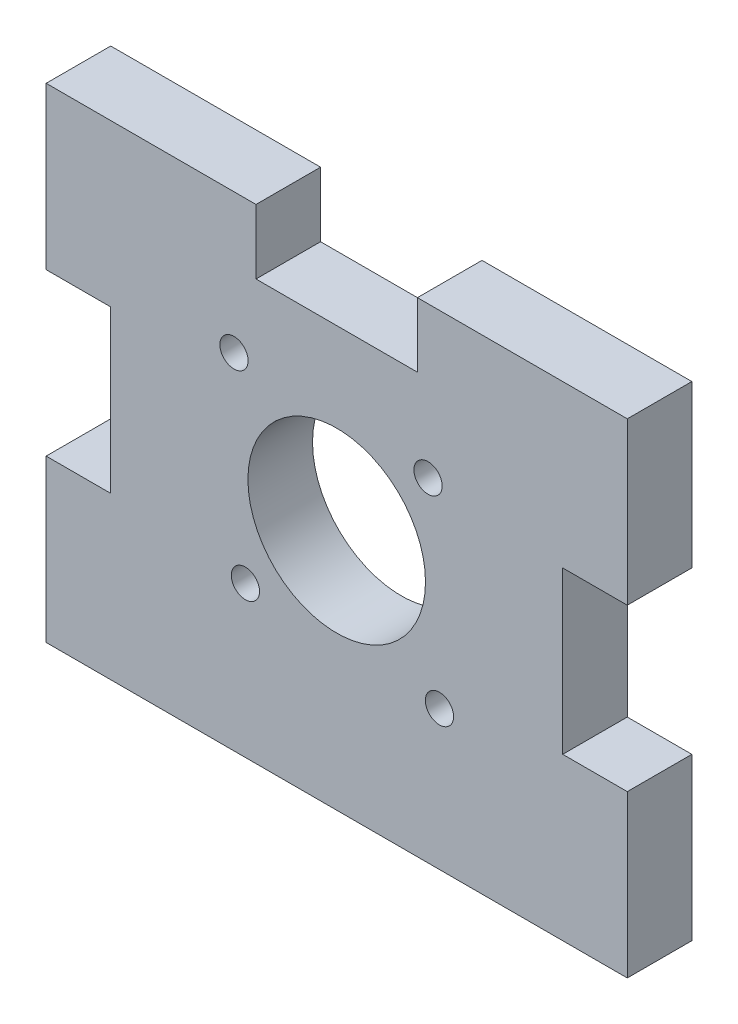
ISO-10303-21;
HEADER;
FILE_DESCRIPTION(('STEP AP214'),'2;1');
FILE_NAME('part.step','',(''),(''),'','','');
FILE_SCHEMA(('AUTOMOTIVE_DESIGN { 1 0 10303 214 1 1 1 1 }'));
ENDSEC;
DATA;
#1=APPLICATION_CONTEXT('core data for automotive mechanical design processes');
#2=APPLICATION_PROTOCOL_DEFINITION('international standard','automotive_design',2000,#1);
#3=PRODUCT_CONTEXT('',#1,'mechanical');
#4=PRODUCT('Part','Part','',(#3));
#5=PRODUCT_RELATED_PRODUCT_CATEGORY('part','',(#4));
#6=PRODUCT_DEFINITION_FORMATION('','',#4);
#7=PRODUCT_DEFINITION_CONTEXT('part definition',#1,'design');
#8=PRODUCT_DEFINITION('design','',#6,#7);
#9=PRODUCT_DEFINITION_SHAPE('','',#8);
#10=(LENGTH_UNIT() NAMED_UNIT(*) SI_UNIT(.MILLI.,.METRE.));
#11=(NAMED_UNIT(*) PLANE_ANGLE_UNIT() SI_UNIT($,.RADIAN.));
#12=(NAMED_UNIT(*) SI_UNIT($,.STERADIAN.) SOLID_ANGLE_UNIT());
#13=UNCERTAINTY_MEASURE_WITH_UNIT(LENGTH_MEASURE(1.E-05),#10,'distance_accuracy_value','');
#14=(GEOMETRIC_REPRESENTATION_CONTEXT(3) GLOBAL_UNCERTAINTY_ASSIGNED_CONTEXT((#13)) GLOBAL_UNIT_ASSIGNED_CONTEXT((#10,
#11,#12)) REPRESENTATION_CONTEXT('',''));
#15=CARTESIAN_POINT('',(0.,0.,0.));
#16=DIRECTION('',(0.,0.,1.));
#17=DIRECTION('',(1.,0.,0.));
#18=AXIS2_PLACEMENT_3D('',#15,#16,#17);
#19=CARTESIAN_POINT('',(-18.,15.,4.));
#20=DIRECTION('',(1.,0.,0.));
#21=DIRECTION('',(0.,1.,0.));
#22=AXIS2_PLACEMENT_3D('',#19,#20,#21);
#23=PLANE('',#22);
#24=DIRECTION('',(0.,-1.,0.));
#25=VECTOR('',#24,1.);
#26=CARTESIAN_POINT('',(-18.,15.,0.));
#27=LINE('',#26,#25);
#28=CARTESIAN_POINT('',(-18.,15.,0.));
#29=VERTEX_POINT('',#28);
#30=CARTESIAN_POINT('',(-18.,5.,0.));
#31=VERTEX_POINT('',#30);
#32=EDGE_CURVE('E329',#29,#31,#27,.T.);
#33=ORIENTED_EDGE('',*,*,#32,.T.);
#34=DIRECTION('',(0.,0.,1.));
#35=VECTOR('',#34,1.);
#36=CARTESIAN_POINT('',(-18.,5.,0.));
#37=LINE('',#36,#35);
#38=CARTESIAN_POINT('',(-18.,5.,4.));
#39=VERTEX_POINT('',#38);
#40=EDGE_CURVE('E212',#31,#39,#37,.T.);
#41=ORIENTED_EDGE('',*,*,#40,.T.);
#42=DIRECTION('',(0.,-1.,0.));
#43=VECTOR('',#42,1.);
#44=CARTESIAN_POINT('',(-18.,15.,4.));
#45=LINE('',#44,#43);
#46=CARTESIAN_POINT('',(-18.,15.,4.));
#47=VERTEX_POINT('',#46);
#48=EDGE_CURVE('E310',#47,#39,#45,.T.);
#49=ORIENTED_EDGE('',*,*,#48,.F.);
#50=DIRECTION('',(0.,0.,-1.));
#51=VECTOR('',#50,1.);
#52=CARTESIAN_POINT('',(-18.,15.,4.));
#53=LINE('',#52,#51);
#54=EDGE_CURVE('E328',#47,#29,#53,.T.);
#55=ORIENTED_EDGE('',*,*,#54,.T.);
#56=EDGE_LOOP('',(#33,#41,#49,#55));
#57=FACE_BOUND('',#56,.T.);
#58=ADVANCED_FACE('F39',(#57),#23,.F.);
#59=CARTESIAN_POINT('',(18.,15.,4.));
#60=DIRECTION('',(-1.,0.,0.));
#61=DIRECTION('',(0.,-1.,0.));
#62=AXIS2_PLACEMENT_3D('',#59,#60,#61);
#63=PLANE('',#62);
#64=DIRECTION('',(0.,1.,0.));
#65=VECTOR('',#64,1.);
#66=CARTESIAN_POINT('',(18.,15.,0.));
#67=LINE('',#66,#65);
#68=CARTESIAN_POINT('',(18.,-15.,0.));
#69=VERTEX_POINT('',#68);
#70=CARTESIAN_POINT('',(18.,-5.,0.));
#71=VERTEX_POINT('',#70);
#72=EDGE_CURVE('E337',#69,#71,#67,.T.);
#73=ORIENTED_EDGE('',*,*,#72,.T.);
#74=DIRECTION('',(0.,0.,1.));
#75=VECTOR('',#74,1.);
#76=CARTESIAN_POINT('',(18.,-5.,0.));
#77=LINE('',#76,#75);
#78=CARTESIAN_POINT('',(18.,-5.,4.));
#79=VERTEX_POINT('',#78);
#80=EDGE_CURVE('E217',#71,#79,#77,.T.);
#81=ORIENTED_EDGE('',*,*,#80,.T.);
#82=DIRECTION('',(0.,1.,0.));
#83=VECTOR('',#82,1.);
#84=CARTESIAN_POINT('',(18.,15.,4.));
#85=LINE('',#84,#83);
#86=CARTESIAN_POINT('',(18.,-15.,4.));
#87=VERTEX_POINT('',#86);
#88=EDGE_CURVE('E319',#87,#79,#85,.T.);
#89=ORIENTED_EDGE('',*,*,#88,.F.);
#90=DIRECTION('',(0.,0.,-1.));
#91=VECTOR('',#90,1.);
#92=CARTESIAN_POINT('',(18.,-15.,4.));
#93=LINE('',#92,#91);
#94=EDGE_CURVE('E48',#87,#69,#93,.T.);
#95=ORIENTED_EDGE('',*,*,#94,.T.);
#96=EDGE_LOOP('',(#73,#81,#89,#95));
#97=FACE_BOUND('',#96,.T.);
#98=ADVANCED_FACE('F357',(#97),#63,.F.);
#99=CARTESIAN_POINT('',(18.,15.,4.));
#100=DIRECTION('',(0.,-1.,0.));
#101=DIRECTION('',(1.,0.,0.));
#102=AXIS2_PLACEMENT_3D('',#99,#100,#101);
#103=PLANE('',#102);
#104=DIRECTION('',(-1.,0.,0.));
#105=VECTOR('',#104,1.);
#106=CARTESIAN_POINT('',(18.,15.,4.));
#107=LINE('',#106,#105);
#108=CARTESIAN_POINT('',(-5.,15.,4.));
#109=VERTEX_POINT('',#108);
#110=EDGE_CURVE('E323',#109,#47,#107,.T.);
#111=ORIENTED_EDGE('',*,*,#110,.F.);
#112=DIRECTION('',(0.,0.,1.));
#113=VECTOR('',#112,1.);
#114=CARTESIAN_POINT('',(-5.,15.,0.));
#115=LINE('',#114,#113);
#116=CARTESIAN_POINT('',(-5.,15.,0.));
#117=VERTEX_POINT('',#116);
#118=EDGE_CURVE('E191',#117,#109,#115,.T.);
#119=ORIENTED_EDGE('',*,*,#118,.F.);
#120=DIRECTION('',(-1.,0.,0.));
#121=VECTOR('',#120,1.);
#122=CARTESIAN_POINT('',(18.,15.,0.));
#123=LINE('',#122,#121);
#124=EDGE_CURVE('E176',#117,#29,#123,.T.);
#125=ORIENTED_EDGE('',*,*,#124,.T.);
#126=ORIENTED_EDGE('',*,*,#54,.F.);
#127=EDGE_LOOP('',(#111,#119,#125,#126));
#128=FACE_BOUND('',#127,.T.);
#129=ADVANCED_FACE('F386',(#128),#103,.F.);
#130=CARTESIAN_POINT('',(-18.,-5.,4.));
#131=VERTEX_POINT('',#130);
#132=CARTESIAN_POINT('',(-18.,-15.,4.));
#133=VERTEX_POINT('',#132);
#134=EDGE_CURVE('E315',#131,#133,#45,.T.);
#135=ORIENTED_EDGE('',*,*,#134,.F.);
#136=DIRECTION('',(0.,0.,1.));
#137=VECTOR('',#136,1.);
#138=CARTESIAN_POINT('',(-18.,-5.,0.));
#139=LINE('',#138,#137);
#140=CARTESIAN_POINT('',(-18.,-5.,0.));
#141=VERTEX_POINT('',#140);
#142=EDGE_CURVE('E229',#141,#131,#139,.T.);
#143=ORIENTED_EDGE('',*,*,#142,.F.);
#144=CARTESIAN_POINT('',(-18.,-15.,0.));
#145=VERTEX_POINT('',#144);
#146=EDGE_CURVE('E306',#141,#145,#27,.T.);
#147=ORIENTED_EDGE('',*,*,#146,.T.);
#148=DIRECTION('',(0.,0.,-1.));
#149=VECTOR('',#148,1.);
#150=CARTESIAN_POINT('',(-18.,-15.,4.));
#151=LINE('',#150,#149);
#152=EDGE_CURVE('E11',#133,#145,#151,.T.);
#153=ORIENTED_EDGE('',*,*,#152,.F.);
#154=EDGE_LOOP('',(#135,#143,#147,#153));
#155=FACE_BOUND('',#154,.T.);
#156=ADVANCED_FACE('F41',(#155),#23,.F.);
#157=CARTESIAN_POINT('',(18.,-15.,4.));
#158=DIRECTION('',(0.,1.,0.));
#159=DIRECTION('',(-1.,0.,0.));
#160=AXIS2_PLACEMENT_3D('',#157,#158,#159);
#161=PLANE('',#160);
#162=DIRECTION('',(1.,0.,0.));
#163=VECTOR('',#162,1.);
#164=CARTESIAN_POINT('',(18.,-15.,0.));
#165=LINE('',#164,#163);
#166=EDGE_CURVE('E333',#145,#69,#165,.T.);
#167=ORIENTED_EDGE('',*,*,#166,.T.);
#168=ORIENTED_EDGE('',*,*,#94,.F.);
#169=DIRECTION('',(1.,0.,0.));
#170=VECTOR('',#169,1.);
#171=CARTESIAN_POINT('',(18.,-15.,4.));
#172=LINE('',#171,#170);
#173=EDGE_CURVE('E314',#133,#87,#172,.T.);
#174=ORIENTED_EDGE('',*,*,#173,.F.);
#175=ORIENTED_EDGE('',*,*,#152,.T.);
#176=EDGE_LOOP('',(#167,#168,#174,#175));
#177=FACE_BOUND('',#176,.T.);
#178=ADVANCED_FACE('F372',(#177),#161,.F.);
#179=CARTESIAN_POINT('',(18.,5.,4.));
#180=VERTEX_POINT('',#179);
#181=CARTESIAN_POINT('',(18.,15.,4.));
#182=VERTEX_POINT('',#181);
#183=EDGE_CURVE('E318',#180,#182,#85,.T.);
#184=ORIENTED_EDGE('',*,*,#183,.F.);
#185=DIRECTION('',(0.,0.,1.));
#186=VECTOR('',#185,1.);
#187=CARTESIAN_POINT('',(18.,5.,0.));
#188=LINE('',#187,#186);
#189=CARTESIAN_POINT('',(18.,5.,0.));
#190=VERTEX_POINT('',#189);
#191=EDGE_CURVE('E248',#190,#180,#188,.T.);
#192=ORIENTED_EDGE('',*,*,#191,.F.);
#193=CARTESIAN_POINT('',(18.,15.,0.));
#194=VERTEX_POINT('',#193);
#195=EDGE_CURVE('E336',#190,#194,#67,.T.);
#196=ORIENTED_EDGE('',*,*,#195,.T.);
#197=DIRECTION('',(0.,0.,-1.));
#198=VECTOR('',#197,1.);
#199=CARTESIAN_POINT('',(18.,15.,4.));
#200=LINE('',#199,#198);
#201=EDGE_CURVE('E348',#182,#194,#200,.T.);
#202=ORIENTED_EDGE('',*,*,#201,.F.);
#203=EDGE_LOOP('',(#184,#192,#196,#202));
#204=FACE_BOUND('',#203,.T.);
#205=ADVANCED_FACE('F410',(#204),#63,.F.);
#206=CARTESIAN_POINT('',(5.,15.,0.));
#207=VERTEX_POINT('',#206);
#208=EDGE_CURVE('E341',#194,#207,#123,.T.);
#209=ORIENTED_EDGE('',*,*,#208,.T.);
#210=DIRECTION('',(0.,0.,1.));
#211=VECTOR('',#210,1.);
#212=CARTESIAN_POINT('',(5.,15.,0.));
#213=LINE('',#212,#211);
#214=CARTESIAN_POINT('',(5.,15.,4.));
#215=VERTEX_POINT('',#214);
#216=EDGE_CURVE('E195',#207,#215,#213,.T.);
#217=ORIENTED_EDGE('',*,*,#216,.T.);
#218=EDGE_CURVE('E324',#182,#215,#107,.T.);
#219=ORIENTED_EDGE('',*,*,#218,.F.);
#220=ORIENTED_EDGE('',*,*,#201,.T.);
#221=EDGE_LOOP('',(#209,#217,#219,#220));
#222=FACE_BOUND('',#221,.T.);
#223=ADVANCED_FACE('F417',(#222),#103,.F.);
#224=CARTESIAN_POINT('',(0.,0.,4.));
#225=DIRECTION('',(0.,0.,-1.));
#226=DIRECTION('',(-1.,0.,0.));
#227=AXIS2_PLACEMENT_3D('',#224,#225,#226);
#228=PLANE('',#227);
#229=CARTESIAN_POINT('',(-6.36396103067891,6.36396103067894,4.));
#230=DIRECTION('',(0.,0.,1.));
#231=DIRECTION('',(-1.,0.,0.));
#232=AXIS2_PLACEMENT_3D('',#229,#230,#231);
#233=CIRCLE('',#232,0.874999999999998);
#234=CARTESIAN_POINT('',(-7.23896103067891,6.36396103067894,4.));
#235=VERTEX_POINT('',#234);
#236=EDGE_CURVE('E194',#235,#235,#233,.T.);
#237=ORIENTED_EDGE('',*,*,#236,.F.);
#238=EDGE_LOOP('',(#237));
#239=FACE_BOUND('',#238,.T.);
#240=CARTESIAN_POINT('',(-5.65685424949239,-5.65685424949237,4.));
#241=DIRECTION('',(0.,0.,1.));
#242=DIRECTION('',(-1.,0.,0.));
#243=AXIS2_PLACEMENT_3D('',#240,#241,#242);
#244=CIRCLE('',#243,0.875000000000001);
#245=CARTESIAN_POINT('',(-6.53185424949239,-5.65685424949237,4.));
#246=VERTEX_POINT('',#245);
#247=EDGE_CURVE('E291',#246,#246,#244,.T.);
#248=ORIENTED_EDGE('',*,*,#247,.F.);
#249=EDGE_LOOP('',(#248));
#250=FACE_BOUND('',#249,.T.);
#251=CARTESIAN_POINT('',(6.36396103067891,-6.36396103067893,4.));
#252=DIRECTION('',(0.,0.,1.));
#253=DIRECTION('',(1.,0.,0.));
#254=AXIS2_PLACEMENT_3D('',#251,#252,#253);
#255=CIRCLE('',#254,0.875);
#256=CARTESIAN_POINT('',(7.23896103067891,-6.36396103067893,4.));
#257=VERTEX_POINT('',#256);
#258=EDGE_CURVE('E283',#257,#257,#255,.T.);
#259=ORIENTED_EDGE('',*,*,#258,.F.);
#260=EDGE_LOOP('',(#259));
#261=FACE_BOUND('',#260,.T.);
#262=CARTESIAN_POINT('',(5.65685424949239,5.65685424949237,4.));
#263=DIRECTION('',(0.,0.,1.));
#264=DIRECTION('',(1.,0.,0.));
#265=AXIS2_PLACEMENT_3D('',#262,#263,#264);
#266=CIRCLE('',#265,0.874999999999999);
#267=CARTESIAN_POINT('',(6.53185424949239,5.65685424949237,4.));
#268=VERTEX_POINT('',#267);
#269=EDGE_CURVE('E275',#268,#268,#266,.T.);
#270=ORIENTED_EDGE('',*,*,#269,.F.);
#271=EDGE_LOOP('',(#270));
#272=FACE_BOUND('',#271,.T.);
#273=CARTESIAN_POINT('',(0.,0.,4.));
#274=DIRECTION('',(0.,0.,1.));
#275=DIRECTION('',(1.,0.,0.));
#276=AXIS2_PLACEMENT_3D('',#273,#274,#275);
#277=CIRCLE('',#276,5.5);
#278=CARTESIAN_POINT('',(5.5,0.,4.));
#279=VERTEX_POINT('',#278);
#280=EDGE_CURVE('E274',#279,#279,#277,.T.);
#281=ORIENTED_EDGE('',*,*,#280,.F.);
#282=EDGE_LOOP('',(#281));
#283=FACE_BOUND('',#282,.T.);
#284=DIRECTION('',(1.,0.,0.));
#285=VECTOR('',#284,1.);
#286=CARTESIAN_POINT('',(-5.,11.,4.));
#287=LINE('',#286,#285);
#288=CARTESIAN_POINT('',(-5.,11.,4.));
#289=VERTEX_POINT('',#288);
#290=CARTESIAN_POINT('',(5.,11.,4.));
#291=VERTEX_POINT('',#290);
#292=EDGE_CURVE('E181',#289,#291,#287,.T.);
#293=ORIENTED_EDGE('',*,*,#292,.F.);
#294=DIRECTION('',(0.,-1.,0.));
#295=VECTOR('',#294,1.);
#296=CARTESIAN_POINT('',(-5.,15.,4.));
#297=LINE('',#296,#295);
#298=EDGE_CURVE('E159',#109,#289,#297,.T.);
#299=ORIENTED_EDGE('',*,*,#298,.F.);
#300=ORIENTED_EDGE('',*,*,#110,.T.);
#301=ORIENTED_EDGE('',*,*,#48,.T.);
#302=DIRECTION('',(-1.,0.,0.));
#303=VECTOR('',#302,1.);
#304=CARTESIAN_POINT('',(-18.,5.,4.));
#305=LINE('',#304,#303);
#306=CARTESIAN_POINT('',(-14.,5.,4.));
#307=VERTEX_POINT('',#306);
#308=EDGE_CURVE('E213',#307,#39,#305,.T.);
#309=ORIENTED_EDGE('',*,*,#308,.F.);
#310=DIRECTION('',(0.,1.,0.));
#311=VECTOR('',#310,1.);
#312=CARTESIAN_POINT('',(-14.,5.,4.));
#313=LINE('',#312,#311);
#314=CARTESIAN_POINT('',(-14.,-5.,4.));
#315=VERTEX_POINT('',#314);
#316=EDGE_CURVE('E206',#315,#307,#313,.T.);
#317=ORIENTED_EDGE('',*,*,#316,.F.);
#318=DIRECTION('',(1.,0.,0.));
#319=VECTOR('',#318,1.);
#320=CARTESIAN_POINT('',(-18.,-5.,4.));
#321=LINE('',#320,#319);
#322=EDGE_CURVE('E216',#131,#315,#321,.T.);
#323=ORIENTED_EDGE('',*,*,#322,.F.);
#324=ORIENTED_EDGE('',*,*,#134,.T.);
#325=ORIENTED_EDGE('',*,*,#173,.T.);
#326=ORIENTED_EDGE('',*,*,#88,.T.);
#327=DIRECTION('',(1.,0.,0.));
#328=VECTOR('',#327,1.);
#329=CARTESIAN_POINT('',(18.,-5.,4.));
#330=LINE('',#329,#328);
#331=CARTESIAN_POINT('',(14.,-5.,4.));
#332=VERTEX_POINT('',#331);
#333=EDGE_CURVE('E240',#332,#79,#330,.T.);
#334=ORIENTED_EDGE('',*,*,#333,.F.);
#335=DIRECTION('',(0.,-1.,0.));
#336=VECTOR('',#335,1.);
#337=CARTESIAN_POINT('',(14.,5.,4.));
#338=LINE('',#337,#336);
#339=CARTESIAN_POINT('',(14.,5.,4.));
#340=VERTEX_POINT('',#339);
#341=EDGE_CURVE('E253',#340,#332,#338,.T.);
#342=ORIENTED_EDGE('',*,*,#341,.F.);
#343=DIRECTION('',(-1.,0.,0.));
#344=VECTOR('',#343,1.);
#345=CARTESIAN_POINT('',(18.,5.,4.));
#346=LINE('',#345,#344);
#347=EDGE_CURVE('E249',#180,#340,#346,.T.);
#348=ORIENTED_EDGE('',*,*,#347,.F.);
#349=ORIENTED_EDGE('',*,*,#183,.T.);
#350=ORIENTED_EDGE('',*,*,#218,.T.);
#351=DIRECTION('',(0.,1.,0.));
#352=VECTOR('',#351,1.);
#353=CARTESIAN_POINT('',(5.,15.,4.));
#354=LINE('',#353,#352);
#355=EDGE_CURVE('E178',#291,#215,#354,.T.);
#356=ORIENTED_EDGE('',*,*,#355,.F.);
#357=EDGE_LOOP('',(#293,#299,#300,#301,#309,#317,#323,#324,#325,#326,#334,#342,#348,#349,#350,#356));
#358=FACE_BOUND('',#357,.T.);
#359=ADVANCED_FACE('F367',(#239,#250,#261,#272,#283,#358),#228,.F.);
#360=CARTESIAN_POINT('',(0.,0.,0.));
#361=DIRECTION('',(0.,0.,-1.));
#362=DIRECTION('',(-1.,0.,0.));
#363=AXIS2_PLACEMENT_3D('',#360,#361,#362);
#364=PLANE('',#363);
#365=DIRECTION('',(0.,-1.,0.));
#366=VECTOR('',#365,1.);
#367=CARTESIAN_POINT('',(-5.,15.,0.));
#368=LINE('',#367,#366);
#369=CARTESIAN_POINT('',(-5.,11.,0.));
#370=VERTEX_POINT('',#369);
#371=EDGE_CURVE('E156',#117,#370,#368,.T.);
#372=ORIENTED_EDGE('',*,*,#371,.T.);
#373=DIRECTION('',(1.,0.,0.));
#374=VECTOR('',#373,1.);
#375=CARTESIAN_POINT('',(-5.,11.,0.));
#376=LINE('',#375,#374);
#377=CARTESIAN_POINT('',(5.,11.,0.));
#378=VERTEX_POINT('',#377);
#379=EDGE_CURVE('E167',#370,#378,#376,.T.);
#380=ORIENTED_EDGE('',*,*,#379,.T.);
#381=DIRECTION('',(0.,1.,0.));
#382=VECTOR('',#381,1.);
#383=CARTESIAN_POINT('',(5.,15.,0.));
#384=LINE('',#383,#382);
#385=EDGE_CURVE('E55',#378,#207,#384,.T.);
#386=ORIENTED_EDGE('',*,*,#385,.T.);
#387=ORIENTED_EDGE('',*,*,#208,.F.);
#388=ORIENTED_EDGE('',*,*,#195,.F.);
#389=DIRECTION('',(-1.,0.,0.));
#390=VECTOR('',#389,1.);
#391=CARTESIAN_POINT('',(18.,5.,0.));
#392=LINE('',#391,#390);
#393=CARTESIAN_POINT('',(14.,5.,0.));
#394=VERTEX_POINT('',#393);
#395=EDGE_CURVE('E235',#190,#394,#392,.T.);
#396=ORIENTED_EDGE('',*,*,#395,.T.);
#397=DIRECTION('',(0.,-1.,0.));
#398=VECTOR('',#397,1.);
#399=CARTESIAN_POINT('',(14.,5.,0.));
#400=LINE('',#399,#398);
#401=CARTESIAN_POINT('',(14.,-5.,0.));
#402=VERTEX_POINT('',#401);
#403=EDGE_CURVE('E239',#394,#402,#400,.T.);
#404=ORIENTED_EDGE('',*,*,#403,.T.);
#405=DIRECTION('',(1.,0.,0.));
#406=VECTOR('',#405,1.);
#407=CARTESIAN_POINT('',(18.,-5.,0.));
#408=LINE('',#407,#406);
#409=EDGE_CURVE('E244',#402,#71,#408,.T.);
#410=ORIENTED_EDGE('',*,*,#409,.T.);
#411=ORIENTED_EDGE('',*,*,#72,.F.);
#412=ORIENTED_EDGE('',*,*,#166,.F.);
#413=ORIENTED_EDGE('',*,*,#146,.F.);
#414=DIRECTION('',(1.,0.,0.));
#415=VECTOR('',#414,1.);
#416=CARTESIAN_POINT('',(-18.,-5.,0.));
#417=LINE('',#416,#415);
#418=CARTESIAN_POINT('',(-14.,-5.,0.));
#419=VERTEX_POINT('',#418);
#420=EDGE_CURVE('E205',#141,#419,#417,.T.);
#421=ORIENTED_EDGE('',*,*,#420,.T.);
#422=DIRECTION('',(0.,1.,0.));
#423=VECTOR('',#422,1.);
#424=CARTESIAN_POINT('',(-14.,5.,0.));
#425=LINE('',#424,#423);
#426=CARTESIAN_POINT('',(-14.,5.,0.));
#427=VERTEX_POINT('',#426);
#428=EDGE_CURVE('E63',#419,#427,#425,.T.);
#429=ORIENTED_EDGE('',*,*,#428,.T.);
#430=DIRECTION('',(-1.,0.,0.));
#431=VECTOR('',#430,1.);
#432=CARTESIAN_POINT('',(-18.,5.,0.));
#433=LINE('',#432,#431);
#434=EDGE_CURVE('E201',#427,#31,#433,.T.);
#435=ORIENTED_EDGE('',*,*,#434,.T.);
#436=ORIENTED_EDGE('',*,*,#32,.F.);
#437=ORIENTED_EDGE('',*,*,#124,.F.);
#438=EDGE_LOOP('',(#372,#380,#386,#387,#388,#396,#404,#410,#411,#412,#413,#421,#429,#435,#436,#437));
#439=FACE_BOUND('',#438,.T.);
#440=CARTESIAN_POINT('',(-6.36396103067891,6.36396103067894,0.));
#441=DIRECTION('',(0.,0.,1.));
#442=DIRECTION('',(-1.,0.,0.));
#443=AXIS2_PLACEMENT_3D('',#440,#441,#442);
#444=CIRCLE('',#443,0.874999999999998);
#445=CARTESIAN_POINT('',(-7.23896103067891,6.36396103067894,0.));
#446=VERTEX_POINT('',#445);
#447=EDGE_CURVE('E295',#446,#446,#444,.T.);
#448=ORIENTED_EDGE('',*,*,#447,.T.);
#449=EDGE_LOOP('',(#448));
#450=FACE_BOUND('',#449,.T.);
#451=CARTESIAN_POINT('',(-5.65685424949239,-5.65685424949237,0.));
#452=DIRECTION('',(0.,0.,1.));
#453=DIRECTION('',(-1.,0.,0.));
#454=AXIS2_PLACEMENT_3D('',#451,#452,#453);
#455=CIRCLE('',#454,0.875000000000001);
#456=CARTESIAN_POINT('',(-6.53185424949239,-5.65685424949237,0.));
#457=VERTEX_POINT('',#456);
#458=EDGE_CURVE('E287',#457,#457,#455,.T.);
#459=ORIENTED_EDGE('',*,*,#458,.T.);
#460=EDGE_LOOP('',(#459));
#461=FACE_BOUND('',#460,.T.);
#462=CARTESIAN_POINT('',(6.36396103067891,-6.36396103067893,0.));
#463=DIRECTION('',(0.,0.,1.));
#464=DIRECTION('',(1.,0.,0.));
#465=AXIS2_PLACEMENT_3D('',#462,#463,#464);
#466=CIRCLE('',#465,0.875);
#467=CARTESIAN_POINT('',(7.23896103067891,-6.36396103067893,0.));
#468=VERTEX_POINT('',#467);
#469=EDGE_CURVE('E279',#468,#468,#466,.T.);
#470=ORIENTED_EDGE('',*,*,#469,.T.);
#471=EDGE_LOOP('',(#470));
#472=FACE_BOUND('',#471,.T.);
#473=CARTESIAN_POINT('',(5.65685424949239,5.65685424949237,0.));
#474=DIRECTION('',(0.,0.,1.));
#475=DIRECTION('',(1.,0.,0.));
#476=AXIS2_PLACEMENT_3D('',#473,#474,#475);
#477=CIRCLE('',#476,0.874999999999999);
#478=CARTESIAN_POINT('',(6.53185424949239,5.65685424949237,0.));
#479=VERTEX_POINT('',#478);
#480=EDGE_CURVE('E270',#479,#479,#477,.T.);
#481=ORIENTED_EDGE('',*,*,#480,.T.);
#482=EDGE_LOOP('',(#481));
#483=FACE_BOUND('',#482,.T.);
#484=CARTESIAN_POINT('',(0.,0.,0.));
#485=DIRECTION('',(0.,0.,1.));
#486=DIRECTION('',(1.,0.,0.));
#487=AXIS2_PLACEMENT_3D('',#484,#485,#486);
#488=CIRCLE('',#487,5.5);
#489=CARTESIAN_POINT('',(5.5,0.,0.));
#490=VERTEX_POINT('',#489);
#491=EDGE_CURVE('E302',#490,#490,#488,.T.);
#492=ORIENTED_EDGE('',*,*,#491,.T.);
#493=EDGE_LOOP('',(#492));
#494=FACE_BOUND('',#493,.T.);
#495=ADVANCED_FACE('F173',(#439,#450,#461,#472,#483,#494),#364,.T.);
#496=CARTESIAN_POINT('',(0.,0.,0.));
#497=DIRECTION('',(0.,0.,1.));
#498=DIRECTION('',(1.,0.,0.));
#499=AXIS2_PLACEMENT_3D('',#496,#497,#498);
#500=CYLINDRICAL_SURFACE('',#499,5.5);
#501=ORIENTED_EDGE('',*,*,#491,.F.);
#502=EDGE_LOOP('',(#501));
#503=FACE_BOUND('',#502,.T.);
#504=ORIENTED_EDGE('',*,*,#280,.T.);
#505=EDGE_LOOP('',(#504));
#506=FACE_BOUND('',#505,.T.);
#507=ADVANCED_FACE('F455',(#503,#506),#500,.F.);
#508=CARTESIAN_POINT('',(5.65685424949239,5.65685424949237,0.));
#509=DIRECTION('',(0.,0.,1.));
#510=DIRECTION('',(1.,0.,0.));
#511=AXIS2_PLACEMENT_3D('',#508,#509,#510);
#512=CYLINDRICAL_SURFACE('',#511,0.874999999999999);
#513=ORIENTED_EDGE('',*,*,#480,.F.);
#514=EDGE_LOOP('',(#513));
#515=FACE_BOUND('',#514,.T.);
#516=ORIENTED_EDGE('',*,*,#269,.T.);
#517=EDGE_LOOP('',(#516));
#518=FACE_BOUND('',#517,.T.);
#519=ADVANCED_FACE('F451',(#515,#518),#512,.F.);
#520=CARTESIAN_POINT('',(6.36396103067891,-6.36396103067893,0.));
#521=DIRECTION('',(0.,0.,1.));
#522=DIRECTION('',(1.,0.,0.));
#523=AXIS2_PLACEMENT_3D('',#520,#521,#522);
#524=CYLINDRICAL_SURFACE('',#523,0.875);
#525=ORIENTED_EDGE('',*,*,#469,.F.);
#526=EDGE_LOOP('',(#525));
#527=FACE_BOUND('',#526,.T.);
#528=ORIENTED_EDGE('',*,*,#258,.T.);
#529=EDGE_LOOP('',(#528));
#530=FACE_BOUND('',#529,.T.);
#531=ADVANCED_FACE('F454',(#527,#530),#524,.F.);
#532=CARTESIAN_POINT('',(-5.65685424949239,-5.65685424949237,0.));
#533=DIRECTION('',(0.,0.,1.));
#534=DIRECTION('',(1.,0.,0.));
#535=AXIS2_PLACEMENT_3D('',#532,#533,#534);
#536=CYLINDRICAL_SURFACE('',#535,0.875000000000001);
#537=ORIENTED_EDGE('',*,*,#458,.F.);
#538=EDGE_LOOP('',(#537));
#539=FACE_BOUND('',#538,.T.);
#540=ORIENTED_EDGE('',*,*,#247,.T.);
#541=EDGE_LOOP('',(#540));
#542=FACE_BOUND('',#541,.T.);
#543=ADVANCED_FACE('F459',(#539,#542),#536,.F.);
#544=CARTESIAN_POINT('',(-6.36396103067891,6.36396103067894,0.));
#545=DIRECTION('',(0.,0.,1.));
#546=DIRECTION('',(1.,0.,0.));
#547=AXIS2_PLACEMENT_3D('',#544,#545,#546);
#548=CYLINDRICAL_SURFACE('',#547,0.874999999999998);
#549=ORIENTED_EDGE('',*,*,#447,.F.);
#550=EDGE_LOOP('',(#549));
#551=FACE_BOUND('',#550,.T.);
#552=ORIENTED_EDGE('',*,*,#236,.T.);
#553=EDGE_LOOP('',(#552));
#554=FACE_BOUND('',#553,.T.);
#555=ADVANCED_FACE('F448',(#551,#554),#548,.F.);
#556=CARTESIAN_POINT('',(18.,-5.,0.));
#557=DIRECTION('',(0.,-1.,0.));
#558=DIRECTION('',(1.,0.,0.));
#559=AXIS2_PLACEMENT_3D('',#556,#557,#558);
#560=PLANE('',#559);
#561=ORIENTED_EDGE('',*,*,#333,.T.);
#562=ORIENTED_EDGE('',*,*,#80,.F.);
#563=ORIENTED_EDGE('',*,*,#409,.F.);
#564=DIRECTION('',(0.,0.,1.));
#565=VECTOR('',#564,1.);
#566=CARTESIAN_POINT('',(14.,-5.,0.));
#567=LINE('',#566,#565);
#568=EDGE_CURVE('E262',#402,#332,#567,.T.);
#569=ORIENTED_EDGE('',*,*,#568,.T.);
#570=EDGE_LOOP('',(#561,#562,#563,#569));
#571=FACE_BOUND('',#570,.T.);
#572=ADVANCED_FACE('F364',(#571),#560,.F.);
#573=CARTESIAN_POINT('',(14.,5.,0.));
#574=DIRECTION('',(-1.,0.,0.));
#575=DIRECTION('',(0.,-1.,0.));
#576=AXIS2_PLACEMENT_3D('',#573,#574,#575);
#577=PLANE('',#576);
#578=ORIENTED_EDGE('',*,*,#341,.T.);
#579=ORIENTED_EDGE('',*,*,#568,.F.);
#580=ORIENTED_EDGE('',*,*,#403,.F.);
#581=DIRECTION('',(0.,0.,1.));
#582=VECTOR('',#581,1.);
#583=CARTESIAN_POINT('',(14.,5.,0.));
#584=LINE('',#583,#582);
#585=EDGE_CURVE('E265',#394,#340,#584,.T.);
#586=ORIENTED_EDGE('',*,*,#585,.T.);
#587=EDGE_LOOP('',(#578,#579,#580,#586));
#588=FACE_BOUND('',#587,.T.);
#589=ADVANCED_FACE('F440',(#588),#577,.F.);
#590=CARTESIAN_POINT('',(18.,5.,0.));
#591=DIRECTION('',(0.,1.,0.));
#592=DIRECTION('',(0.,0.,1.));
#593=AXIS2_PLACEMENT_3D('',#590,#591,#592);
#594=PLANE('',#593);
#595=ORIENTED_EDGE('',*,*,#347,.T.);
#596=ORIENTED_EDGE('',*,*,#585,.F.);
#597=ORIENTED_EDGE('',*,*,#395,.F.);
#598=ORIENTED_EDGE('',*,*,#191,.T.);
#599=EDGE_LOOP('',(#595,#596,#597,#598));
#600=FACE_BOUND('',#599,.T.);
#601=ADVANCED_FACE('F402',(#600),#594,.F.);
#602=CARTESIAN_POINT('',(-18.,5.,0.));
#603=DIRECTION('',(0.,1.,0.));
#604=DIRECTION('',(0.,0.,1.));
#605=AXIS2_PLACEMENT_3D('',#602,#603,#604);
#606=PLANE('',#605);
#607=ORIENTED_EDGE('',*,*,#308,.T.);
#608=ORIENTED_EDGE('',*,*,#40,.F.);
#609=ORIENTED_EDGE('',*,*,#434,.F.);
#610=DIRECTION('',(0.,0.,1.));
#611=VECTOR('',#610,1.);
#612=CARTESIAN_POINT('',(-14.,5.,0.));
#613=LINE('',#612,#611);
#614=EDGE_CURVE('E188',#427,#307,#613,.T.);
#615=ORIENTED_EDGE('',*,*,#614,.T.);
#616=EDGE_LOOP('',(#607,#608,#609,#615));
#617=FACE_BOUND('',#616,.T.);
#618=ADVANCED_FACE('F390',(#617),#606,.F.);
#619=CARTESIAN_POINT('',(-14.,5.,0.));
#620=DIRECTION('',(1.,0.,0.));
#621=DIRECTION('',(0.,1.,0.));
#622=AXIS2_PLACEMENT_3D('',#619,#620,#621);
#623=PLANE('',#622);
#624=ORIENTED_EDGE('',*,*,#316,.T.);
#625=ORIENTED_EDGE('',*,*,#614,.F.);
#626=ORIENTED_EDGE('',*,*,#428,.F.);
#627=DIRECTION('',(0.,0.,1.));
#628=VECTOR('',#627,1.);
#629=CARTESIAN_POINT('',(-14.,-5.,0.));
#630=LINE('',#629,#628);
#631=EDGE_CURVE('E226',#419,#315,#630,.T.);
#632=ORIENTED_EDGE('',*,*,#631,.T.);
#633=EDGE_LOOP('',(#624,#625,#626,#632));
#634=FACE_BOUND('',#633,.T.);
#635=ADVANCED_FACE('F394',(#634),#623,.F.);
#636=CARTESIAN_POINT('',(-18.,-5.,0.));
#637=DIRECTION('',(0.,-1.,0.));
#638=DIRECTION('',(1.,0.,0.));
#639=AXIS2_PLACEMENT_3D('',#636,#637,#638);
#640=PLANE('',#639);
#641=ORIENTED_EDGE('',*,*,#322,.T.);
#642=ORIENTED_EDGE('',*,*,#631,.F.);
#643=ORIENTED_EDGE('',*,*,#420,.F.);
#644=ORIENTED_EDGE('',*,*,#142,.T.);
#645=EDGE_LOOP('',(#641,#642,#643,#644));
#646=FACE_BOUND('',#645,.T.);
#647=ADVANCED_FACE('F392',(#646),#640,.F.);
#648=CARTESIAN_POINT('',(-5.,15.,0.));
#649=DIRECTION('',(-1.,0.,0.));
#650=DIRECTION('',(0.,0.,1.));
#651=AXIS2_PLACEMENT_3D('',#648,#649,#650);
#652=PLANE('',#651);
#653=ORIENTED_EDGE('',*,*,#298,.T.);
#654=DIRECTION('',(0.,0.,1.));
#655=VECTOR('',#654,1.);
#656=CARTESIAN_POINT('',(-5.,11.,0.));
#657=LINE('',#656,#655);
#658=EDGE_CURVE('E152',#370,#289,#657,.T.);
#659=ORIENTED_EDGE('',*,*,#658,.F.);
#660=ORIENTED_EDGE('',*,*,#371,.F.);
#661=ORIENTED_EDGE('',*,*,#118,.T.);
#662=EDGE_LOOP('',(#653,#659,#660,#661));
#663=FACE_BOUND('',#662,.T.);
#664=ADVANCED_FACE('F154',(#663),#652,.F.);
#665=CARTESIAN_POINT('',(5.,15.,0.));
#666=DIRECTION('',(1.,0.,0.));
#667=DIRECTION('',(0.,1.,0.));
#668=AXIS2_PLACEMENT_3D('',#665,#666,#667);
#669=PLANE('',#668);
#670=ORIENTED_EDGE('',*,*,#355,.T.);
#671=ORIENTED_EDGE('',*,*,#216,.F.);
#672=ORIENTED_EDGE('',*,*,#385,.F.);
#673=DIRECTION('',(0.,0.,1.));
#674=VECTOR('',#673,1.);
#675=CARTESIAN_POINT('',(5.,11.,0.));
#676=LINE('',#675,#674);
#677=EDGE_CURVE('E164',#378,#291,#676,.T.);
#678=ORIENTED_EDGE('',*,*,#677,.T.);
#679=EDGE_LOOP('',(#670,#671,#672,#678));
#680=FACE_BOUND('',#679,.T.);
#681=ADVANCED_FACE('F535',(#680),#669,.F.);
#682=CARTESIAN_POINT('',(-5.,11.,0.));
#683=DIRECTION('',(0.,-1.,0.));
#684=DIRECTION('',(0.,0.,-1.));
#685=AXIS2_PLACEMENT_3D('',#682,#683,#684);
#686=PLANE('',#685);
#687=ORIENTED_EDGE('',*,*,#292,.T.);
#688=ORIENTED_EDGE('',*,*,#677,.F.);
#689=ORIENTED_EDGE('',*,*,#379,.F.);
#690=ORIENTED_EDGE('',*,*,#658,.T.);
#691=EDGE_LOOP('',(#687,#688,#689,#690));
#692=FACE_BOUND('',#691,.T.);
#693=ADVANCED_FACE('F168',(#692),#686,.F.);
#694=CLOSED_SHELL('',(#58,#98,#129,#156,#178,#205,#223,#359,#495,#507,#519,#531,#543,#555,#572,
#589,#601,#618,#635,#647,#664,#681,#693));
#695=MANIFOLD_SOLID_BREP('B2',#694);
#696=ADVANCED_BREP_SHAPE_REPRESENTATION('',(#18,#695),#14);
#697=SHAPE_DEFINITION_REPRESENTATION(#9,#696);
ENDSEC;
END-ISO-10303-21;
